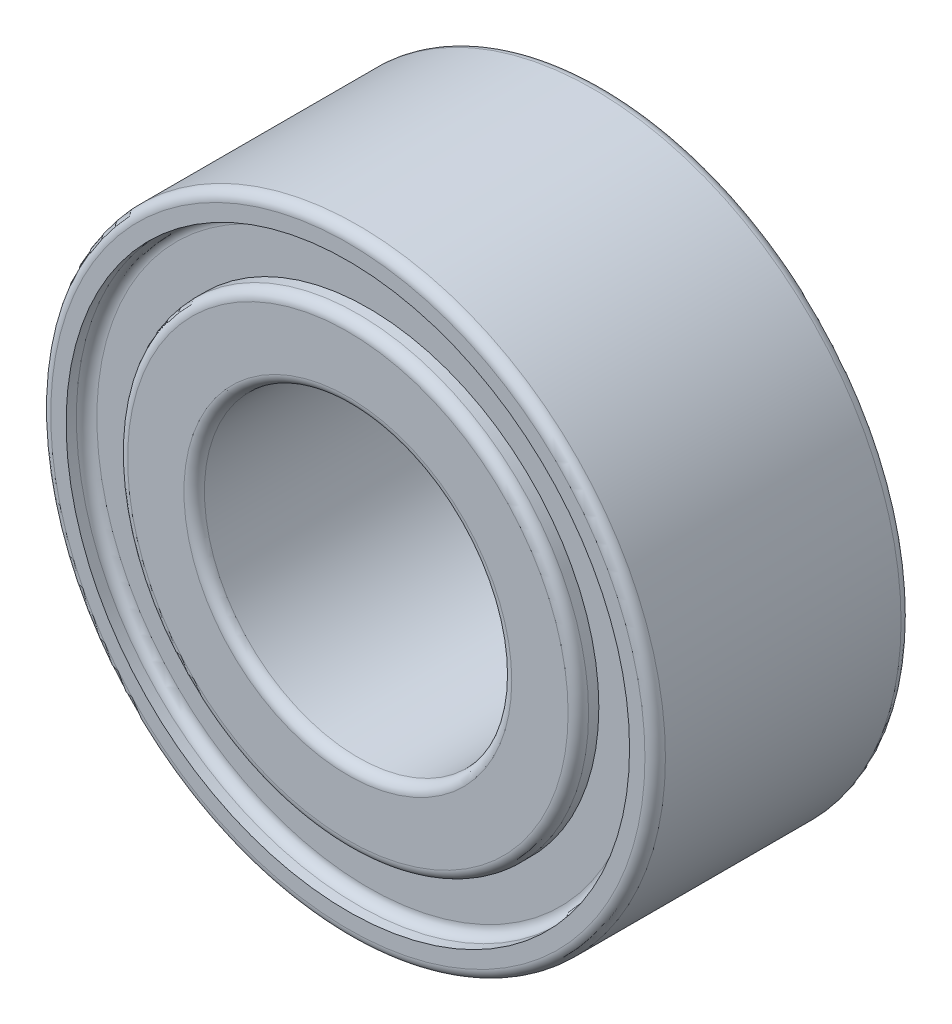
ISO-10303-21;
HEADER;
FILE_DESCRIPTION(('STEP AP214'),'2;1');
FILE_NAME('part.step','',(''),(''),'','','');
FILE_SCHEMA(('AUTOMOTIVE_DESIGN { 1 0 10303 214 1 1 1 1 }'));
ENDSEC;
DATA;
#1=APPLICATION_CONTEXT('core data for automotive mechanical design processes');
#2=APPLICATION_PROTOCOL_DEFINITION('international standard','automotive_design',2000,#1);
#3=PRODUCT_CONTEXT('',#1,'mechanical');
#4=PRODUCT('Part','Part','',(#3));
#5=PRODUCT_RELATED_PRODUCT_CATEGORY('part','',(#4));
#6=PRODUCT_DEFINITION_FORMATION('','',#4);
#7=PRODUCT_DEFINITION_CONTEXT('part definition',#1,'design');
#8=PRODUCT_DEFINITION('design','',#6,#7);
#9=PRODUCT_DEFINITION_SHAPE('','',#8);
#10=(LENGTH_UNIT() NAMED_UNIT(*) SI_UNIT(.MILLI.,.METRE.));
#11=(NAMED_UNIT(*) PLANE_ANGLE_UNIT() SI_UNIT($,.RADIAN.));
#12=(NAMED_UNIT(*) SI_UNIT($,.STERADIAN.) SOLID_ANGLE_UNIT());
#13=UNCERTAINTY_MEASURE_WITH_UNIT(LENGTH_MEASURE(1.E-05),#10,'distance_accuracy_value','');
#14=(GEOMETRIC_REPRESENTATION_CONTEXT(3) GLOBAL_UNCERTAINTY_ASSIGNED_CONTEXT((#13)) GLOBAL_UNIT_ASSIGNED_CONTEXT((#10,
#11,#12)) REPRESENTATION_CONTEXT('',''));
#15=CARTESIAN_POINT('',(0.,0.,0.));
#16=DIRECTION('',(0.,0.,1.));
#17=DIRECTION('',(1.,0.,0.));
#18=AXIS2_PLACEMENT_3D('',#15,#16,#17);
#19=CARTESIAN_POINT('',(0.,0.,0.));
#20=DIRECTION('',(0.,0.,1.));
#21=DIRECTION('',(1.,0.,0.));
#22=AXIS2_PLACEMENT_3D('',#19,#20,#21);
#23=PLANE('',#22);
#24=CARTESIAN_POINT('',(0.,0.,0.));
#25=DIRECTION('',(0.,0.,1.));
#26=DIRECTION('',(1.,0.,0.));
#27=AXIS2_PLACEMENT_3D('',#24,#25,#26);
#28=CIRCLE('',#27,1.6);
#29=CARTESIAN_POINT('',(1.6,0.,0.));
#30=VERTEX_POINT('',#29);
#31=EDGE_CURVE('E72',#30,#30,#28,.T.);
#32=ORIENTED_EDGE('',*,*,#31,.T.);
#33=EDGE_LOOP('',(#32));
#34=FACE_BOUND('',#33,.T.);
#35=CARTESIAN_POINT('',(0.,0.,0.));
#36=DIRECTION('',(0.,0.,1.));
#37=DIRECTION('',(1.,0.,0.));
#38=AXIS2_PLACEMENT_3D('',#35,#36,#37);
#39=CIRCLE('',#38,2.15);
#40=CARTESIAN_POINT('',(2.15,0.,0.));
#41=VERTEX_POINT('',#40);
#42=EDGE_CURVE('E75',#41,#41,#39,.F.);
#43=ORIENTED_EDGE('',*,*,#42,.T.);
#44=EDGE_LOOP('',(#43));
#45=FACE_BOUND('',#44,.T.);
#46=ADVANCED_FACE('F37',(#34,#45),#23,.F.);
#47=CARTESIAN_POINT('',(0.,0.,2.5));
#48=DIRECTION('',(0.,0.,1.));
#49=DIRECTION('',(1.,0.,0.));
#50=AXIS2_PLACEMENT_3D('',#47,#48,#49);
#51=PLANE('',#50);
#52=CARTESIAN_POINT('',(0.,0.,2.5));
#53=DIRECTION('',(0.,0.,1.));
#54=DIRECTION('',(1.,0.,0.));
#55=AXIS2_PLACEMENT_3D('',#52,#53,#54);
#56=CIRCLE('',#55,2.15);
#57=CARTESIAN_POINT('',(2.15,0.,2.5));
#58=VERTEX_POINT('',#57);
#59=EDGE_CURVE('E87',#58,#58,#56,.T.);
#60=ORIENTED_EDGE('',*,*,#59,.T.);
#61=EDGE_LOOP('',(#60));
#62=FACE_BOUND('',#61,.T.);
#63=CARTESIAN_POINT('',(0.,0.,2.5));
#64=DIRECTION('',(0.,0.,1.));
#65=DIRECTION('',(1.,0.,0.));
#66=AXIS2_PLACEMENT_3D('',#63,#64,#65);
#67=CIRCLE('',#66,1.6);
#68=CARTESIAN_POINT('',(1.6,0.,2.5));
#69=VERTEX_POINT('',#68);
#70=EDGE_CURVE('E90',#69,#69,#67,.F.);
#71=ORIENTED_EDGE('',*,*,#70,.T.);
#72=EDGE_LOOP('',(#71));
#73=FACE_BOUND('',#72,.T.);
#74=ADVANCED_FACE('F124',(#62,#73),#51,.T.);
#75=CARTESIAN_POINT('',(0.,0.,2.5));
#76=DIRECTION('',(0.,0.,1.));
#77=DIRECTION('',(1.,0.,0.));
#78=AXIS2_PLACEMENT_3D('',#75,#76,#77);
#79=CIRCLE('',#78,2.9);
#80=CARTESIAN_POINT('',(2.9,0.,2.5));
#81=VERTEX_POINT('',#80);
#82=EDGE_CURVE('E48',#81,#81,#79,.T.);
#83=ORIENTED_EDGE('',*,*,#82,.T.);
#84=EDGE_LOOP('',(#83));
#85=FACE_BOUND('',#84,.T.);
#86=CARTESIAN_POINT('',(0.,0.,2.5));
#87=DIRECTION('',(0.,0.,1.));
#88=DIRECTION('',(1.,0.,0.));
#89=AXIS2_PLACEMENT_3D('',#86,#87,#88);
#90=CIRCLE('',#89,2.75);
#91=CARTESIAN_POINT('',(2.75,0.,2.5));
#92=VERTEX_POINT('',#91);
#93=EDGE_CURVE('E93',#92,#92,#90,.T.);
#94=ORIENTED_EDGE('',*,*,#93,.F.);
#95=EDGE_LOOP('',(#94));
#96=FACE_BOUND('',#95,.T.);
#97=ADVANCED_FACE('F131',(#85,#96),#51,.T.);
#98=CARTESIAN_POINT('',(0.,0.,0.));
#99=DIRECTION('',(0.,0.,1.));
#100=DIRECTION('',(1.,0.,0.));
#101=AXIS2_PLACEMENT_3D('',#98,#99,#100);
#102=CIRCLE('',#101,2.85);
#103=CARTESIAN_POINT('',(2.85,0.,0.));
#104=VERTEX_POINT('',#103);
#105=EDGE_CURVE('E63',#104,#104,#102,.T.);
#106=ORIENTED_EDGE('',*,*,#105,.T.);
#107=EDGE_LOOP('',(#106));
#108=FACE_BOUND('',#107,.T.);
#109=CARTESIAN_POINT('',(0.,0.,0.));
#110=DIRECTION('',(0.,0.,1.));
#111=DIRECTION('',(1.,0.,0.));
#112=AXIS2_PLACEMENT_3D('',#109,#110,#111);
#113=CIRCLE('',#112,2.9);
#114=CARTESIAN_POINT('',(2.9,0.,0.));
#115=VERTEX_POINT('',#114);
#116=EDGE_CURVE('E66',#115,#115,#113,.F.);
#117=ORIENTED_EDGE('',*,*,#116,.T.);
#118=EDGE_LOOP('',(#117));
#119=FACE_BOUND('',#118,.T.);
#120=ADVANCED_FACE('F127',(#108,#119),#23,.F.);
#121=CARTESIAN_POINT('',(0.,0.,2.5));
#122=DIRECTION('',(0.,0.,-1.));
#123=DIRECTION('',(-1.,0.,0.));
#124=AXIS2_PLACEMENT_3D('',#121,#122,#123);
#125=CYLINDRICAL_SURFACE('',#124,3.);
#126=CARTESIAN_POINT('',(0.,0.,0.0999999999999998));
#127=DIRECTION('',(0.,0.,1.));
#128=DIRECTION('',(1.,0.,0.));
#129=AXIS2_PLACEMENT_3D('',#126,#127,#128);
#130=CIRCLE('',#129,3.);
#131=CARTESIAN_POINT('',(3.,0.,0.0999999999999998));
#132=VERTEX_POINT('',#131);
#133=EDGE_CURVE('E52',#132,#132,#130,.T.);
#134=ORIENTED_EDGE('',*,*,#133,.T.);
#135=EDGE_LOOP('',(#134));
#136=FACE_BOUND('',#135,.T.);
#137=CARTESIAN_POINT('',(0.,0.,2.4));
#138=DIRECTION('',(0.,0.,1.));
#139=DIRECTION('',(1.,0.,0.));
#140=AXIS2_PLACEMENT_3D('',#137,#138,#139);
#141=CIRCLE('',#140,3.);
#142=CARTESIAN_POINT('',(3.,0.,2.4));
#143=VERTEX_POINT('',#142);
#144=EDGE_CURVE('E57',#143,#143,#141,.F.);
#145=ORIENTED_EDGE('',*,*,#144,.T.);
#146=EDGE_LOOP('',(#145));
#147=FACE_BOUND('',#146,.T.);
#148=ADVANCED_FACE('F137',(#136,#147),#125,.T.);
#149=CARTESIAN_POINT('',(0.,0.,2.5));
#150=DIRECTION('',(0.,0.,-1.));
#151=DIRECTION('',(-1.,0.,0.));
#152=AXIS2_PLACEMENT_3D('',#149,#150,#151);
#153=CYLINDRICAL_SURFACE('',#152,1.5);
#154=CARTESIAN_POINT('',(0.,0.,2.4));
#155=DIRECTION('',(0.,0.,1.));
#156=DIRECTION('',(1.,0.,0.));
#157=AXIS2_PLACEMENT_3D('',#154,#155,#156);
#158=CIRCLE('',#157,1.5);
#159=CARTESIAN_POINT('',(1.5,0.,2.4));
#160=VERTEX_POINT('',#159);
#161=EDGE_CURVE('E78',#160,#160,#158,.T.);
#162=ORIENTED_EDGE('',*,*,#161,.T.);
#163=EDGE_LOOP('',(#162));
#164=FACE_BOUND('',#163,.T.);
#165=CARTESIAN_POINT('',(0.,0.,0.0999999999999998));
#166=DIRECTION('',(0.,0.,1.));
#167=DIRECTION('',(1.,0.,0.));
#168=AXIS2_PLACEMENT_3D('',#165,#166,#167);
#169=CIRCLE('',#168,1.5);
#170=CARTESIAN_POINT('',(1.5,0.,0.0999999999999998));
#171=VERTEX_POINT('',#170);
#172=EDGE_CURVE('E81',#171,#171,#169,.F.);
#173=ORIENTED_EDGE('',*,*,#172,.T.);
#174=EDGE_LOOP('',(#173));
#175=FACE_BOUND('',#174,.T.);
#176=ADVANCED_FACE('F143',(#164,#175),#153,.F.);
#177=CARTESIAN_POINT('',(0.,0.,2.3));
#178=DIRECTION('',(0.,0.,1.));
#179=DIRECTION('',(1.,0.,0.));
#180=AXIS2_PLACEMENT_3D('',#177,#178,#179);
#181=CYLINDRICAL_SURFACE('',#180,2.75);
#182=CARTESIAN_POINT('',(0.,0.,2.4));
#183=DIRECTION('',(0.,0.,1.));
#184=DIRECTION('',(1.,0.,0.));
#185=AXIS2_PLACEMENT_3D('',#182,#183,#184);
#186=CIRCLE('',#185,2.75);
#187=CARTESIAN_POINT('',(2.75,0.,2.4));
#188=VERTEX_POINT('',#187);
#189=EDGE_CURVE('E10',#188,#188,#186,.F.);
#190=ORIENTED_EDGE('',*,*,#189,.T.);
#191=EDGE_LOOP('',(#190));
#192=FACE_BOUND('',#191,.T.);
#193=ORIENTED_EDGE('',*,*,#93,.T.);
#194=EDGE_LOOP('',(#193));
#195=FACE_BOUND('',#194,.T.);
#196=ADVANCED_FACE('F166',(#192,#195),#181,.F.);
#197=CARTESIAN_POINT('',(0.,0.,2.3));
#198=DIRECTION('',(0.,0.,1.));
#199=DIRECTION('',(1.,0.,0.));
#200=AXIS2_PLACEMENT_3D('',#197,#198,#199);
#201=PLANE('',#200);
#202=CARTESIAN_POINT('',(0.,0.,2.3));
#203=DIRECTION('',(0.,0.,1.));
#204=DIRECTION('',(1.,0.,0.));
#205=AXIS2_PLACEMENT_3D('',#202,#203,#204);
#206=CIRCLE('',#205,2.65);
#207=CARTESIAN_POINT('',(2.65,0.,2.3));
#208=VERTEX_POINT('',#207);
#209=EDGE_CURVE('E44',#208,#208,#206,.T.);
#210=ORIENTED_EDGE('',*,*,#209,.T.);
#211=EDGE_LOOP('',(#210));
#212=FACE_BOUND('',#211,.T.);
#213=CARTESIAN_POINT('',(0.,0.,2.3));
#214=DIRECTION('',(0.,0.,1.));
#215=DIRECTION('',(1.,0.,0.));
#216=AXIS2_PLACEMENT_3D('',#213,#214,#215);
#217=CIRCLE('',#216,2.25);
#218=CARTESIAN_POINT('',(2.25,0.,2.3));
#219=VERTEX_POINT('',#218);
#220=EDGE_CURVE('E96',#219,#219,#217,.T.);
#221=ORIENTED_EDGE('',*,*,#220,.F.);
#222=EDGE_LOOP('',(#221));
#223=FACE_BOUND('',#222,.T.);
#224=ADVANCED_FACE('F168',(#212,#223),#201,.T.);
#225=CARTESIAN_POINT('',(0.,0.,2.3));
#226=DIRECTION('',(0.,0.,1.));
#227=DIRECTION('',(1.,0.,0.));
#228=AXIS2_PLACEMENT_3D('',#225,#226,#227);
#229=CYLINDRICAL_SURFACE('',#228,2.25);
#230=CARTESIAN_POINT('',(0.,0.,2.4));
#231=DIRECTION('',(0.,0.,1.));
#232=DIRECTION('',(1.,0.,0.));
#233=AXIS2_PLACEMENT_3D('',#230,#231,#232);
#234=CIRCLE('',#233,2.25);
#235=CARTESIAN_POINT('',(2.25,0.,2.4));
#236=VERTEX_POINT('',#235);
#237=EDGE_CURVE('E84',#236,#236,#234,.F.);
#238=ORIENTED_EDGE('',*,*,#237,.T.);
#239=EDGE_LOOP('',(#238));
#240=FACE_BOUND('',#239,.T.);
#241=ORIENTED_EDGE('',*,*,#220,.T.);
#242=EDGE_LOOP('',(#241));
#243=FACE_BOUND('',#242,.T.);
#244=ADVANCED_FACE('F174',(#240,#243),#229,.T.);
#245=CARTESIAN_POINT('',(0.,0.,0.));
#246=DIRECTION('',(0.,0.,1.));
#247=DIRECTION('',(1.,0.,0.));
#248=AXIS2_PLACEMENT_3D('',#245,#246,#247);
#249=CYLINDRICAL_SURFACE('',#248,2.75);
#250=CARTESIAN_POINT('',(0.,0.,0.1));
#251=DIRECTION('',(0.,0.,1.));
#252=DIRECTION('',(1.,0.,0.));
#253=AXIS2_PLACEMENT_3D('',#250,#251,#252);
#254=CIRCLE('',#253,2.75);
#255=CARTESIAN_POINT('',(2.75,0.,0.1));
#256=VERTEX_POINT('',#255);
#257=EDGE_CURVE('E60',#256,#256,#254,.F.);
#258=ORIENTED_EDGE('',*,*,#257,.T.);
#259=EDGE_LOOP('',(#258));
#260=FACE_BOUND('',#259,.T.);
#261=CARTESIAN_POINT('',(0.,0.,0.2));
#262=DIRECTION('',(0.,0.,1.));
#263=DIRECTION('',(1.,0.,0.));
#264=AXIS2_PLACEMENT_3D('',#261,#262,#263);
#265=CIRCLE('',#264,2.75);
#266=CARTESIAN_POINT('',(2.75,0.,0.2));
#267=VERTEX_POINT('',#266);
#268=EDGE_CURVE('E99',#267,#267,#265,.T.);
#269=ORIENTED_EDGE('',*,*,#268,.T.);
#270=EDGE_LOOP('',(#269));
#271=FACE_BOUND('',#270,.T.);
#272=ADVANCED_FACE('F121',(#260,#271),#249,.F.);
#273=CARTESIAN_POINT('',(0.,0.,0.2));
#274=DIRECTION('',(0.,0.,1.));
#275=DIRECTION('',(1.,0.,0.));
#276=AXIS2_PLACEMENT_3D('',#273,#274,#275);
#277=PLANE('',#276);
#278=CARTESIAN_POINT('',(0.,0.,0.2));
#279=DIRECTION('',(0.,0.,1.));
#280=DIRECTION('',(1.,0.,0.));
#281=AXIS2_PLACEMENT_3D('',#278,#279,#280);
#282=CIRCLE('',#281,2.25);
#283=CARTESIAN_POINT('',(2.25,0.,0.2));
#284=VERTEX_POINT('',#283);
#285=EDGE_CURVE('E102',#284,#284,#282,.T.);
#286=ORIENTED_EDGE('',*,*,#285,.T.);
#287=EDGE_LOOP('',(#286));
#288=FACE_BOUND('',#287,.T.);
#289=ORIENTED_EDGE('',*,*,#268,.F.);
#290=EDGE_LOOP('',(#289));
#291=FACE_BOUND('',#290,.T.);
#292=ADVANCED_FACE('F106',(#288,#291),#277,.F.);
#293=CARTESIAN_POINT('',(0.,0.,0.));
#294=DIRECTION('',(0.,0.,1.));
#295=DIRECTION('',(1.,0.,0.));
#296=AXIS2_PLACEMENT_3D('',#293,#294,#295);
#297=CYLINDRICAL_SURFACE('',#296,2.25);
#298=CARTESIAN_POINT('',(0.,0.,0.1));
#299=DIRECTION('',(0.,0.,1.));
#300=DIRECTION('',(1.,0.,0.));
#301=AXIS2_PLACEMENT_3D('',#298,#299,#300);
#302=CIRCLE('',#301,2.25);
#303=CARTESIAN_POINT('',(2.25,0.,0.1));
#304=VERTEX_POINT('',#303);
#305=EDGE_CURVE('E69',#304,#304,#302,.T.);
#306=ORIENTED_EDGE('',*,*,#305,.T.);
#307=EDGE_LOOP('',(#306));
#308=FACE_BOUND('',#307,.T.);
#309=ORIENTED_EDGE('',*,*,#285,.F.);
#310=EDGE_LOOP('',(#309));
#311=FACE_BOUND('',#310,.T.);
#312=ADVANCED_FACE('F109',(#308,#311),#297,.T.);
#313=CARTESIAN_POINT('',(0.,0.,2.4));
#314=DIRECTION('',(0.,0.,1.));
#315=DIRECTION('',(1.,0.,0.));
#316=AXIS2_PLACEMENT_3D('',#313,#314,#315);
#317=TOROIDAL_SURFACE('',#316,2.15,0.1);
#318=ORIENTED_EDGE('',*,*,#237,.F.);
#319=EDGE_LOOP('',(#318));
#320=FACE_BOUND('',#319,.T.);
#321=ORIENTED_EDGE('',*,*,#59,.F.);
#322=EDGE_LOOP('',(#321));
#323=FACE_BOUND('',#322,.T.);
#324=ADVANCED_FACE('F111',(#320,#323),#317,.T.);
#325=CARTESIAN_POINT('',(0.,0.,2.4));
#326=DIRECTION('',(0.,0.,1.));
#327=DIRECTION('',(1.,0.,0.));
#328=AXIS2_PLACEMENT_3D('',#325,#326,#327);
#329=TOROIDAL_SURFACE('',#328,1.6,0.1);
#330=ORIENTED_EDGE('',*,*,#70,.F.);
#331=EDGE_LOOP('',(#330));
#332=FACE_BOUND('',#331,.T.);
#333=ORIENTED_EDGE('',*,*,#161,.F.);
#334=EDGE_LOOP('',(#333));
#335=FACE_BOUND('',#334,.T.);
#336=ADVANCED_FACE('F118',(#332,#335),#329,.T.);
#337=CARTESIAN_POINT('',(0.,0.,0.0999999999999998));
#338=DIRECTION('',(0.,0.,1.));
#339=DIRECTION('',(1.,0.,0.));
#340=AXIS2_PLACEMENT_3D('',#337,#338,#339);
#341=TOROIDAL_SURFACE('',#340,1.6,0.1);
#342=ORIENTED_EDGE('',*,*,#172,.F.);
#343=EDGE_LOOP('',(#342));
#344=FACE_BOUND('',#343,.T.);
#345=ORIENTED_EDGE('',*,*,#31,.F.);
#346=EDGE_LOOP('',(#345));
#347=FACE_BOUND('',#346,.T.);
#348=ADVANCED_FACE('F197',(#344,#347),#341,.T.);
#349=CARTESIAN_POINT('',(0.,0.,0.1));
#350=DIRECTION('',(0.,0.,1.));
#351=DIRECTION('',(1.,0.,0.));
#352=AXIS2_PLACEMENT_3D('',#349,#350,#351);
#353=TOROIDAL_SURFACE('',#352,2.15,0.1);
#354=ORIENTED_EDGE('',*,*,#42,.F.);
#355=EDGE_LOOP('',(#354));
#356=FACE_BOUND('',#355,.T.);
#357=ORIENTED_EDGE('',*,*,#305,.F.);
#358=EDGE_LOOP('',(#357));
#359=FACE_BOUND('',#358,.T.);
#360=ADVANCED_FACE('F192',(#356,#359),#353,.T.);
#361=CARTESIAN_POINT('',(0.,0.,0.1));
#362=DIRECTION('',(0.,0.,1.));
#363=DIRECTION('',(1.,0.,0.));
#364=AXIS2_PLACEMENT_3D('',#361,#362,#363);
#365=TOROIDAL_SURFACE('',#364,2.85,0.1);
#366=ORIENTED_EDGE('',*,*,#257,.F.);
#367=EDGE_LOOP('',(#366));
#368=FACE_BOUND('',#367,.T.);
#369=ORIENTED_EDGE('',*,*,#105,.F.);
#370=EDGE_LOOP('',(#369));
#371=FACE_BOUND('',#370,.T.);
#372=ADVANCED_FACE('F154',(#368,#371),#365,.T.);
#373=CARTESIAN_POINT('',(0.,0.,0.0999999999999998));
#374=DIRECTION('',(0.,0.,1.));
#375=DIRECTION('',(1.,0.,0.));
#376=AXIS2_PLACEMENT_3D('',#373,#374,#375);
#377=TOROIDAL_SURFACE('',#376,2.9,0.1);
#378=ORIENTED_EDGE('',*,*,#116,.F.);
#379=EDGE_LOOP('',(#378));
#380=FACE_BOUND('',#379,.T.);
#381=ORIENTED_EDGE('',*,*,#133,.F.);
#382=EDGE_LOOP('',(#381));
#383=FACE_BOUND('',#382,.T.);
#384=ADVANCED_FACE('F150',(#380,#383),#377,.T.);
#385=CARTESIAN_POINT('',(0.,0.,2.4));
#386=DIRECTION('',(0.,0.,1.));
#387=DIRECTION('',(1.,0.,0.));
#388=AXIS2_PLACEMENT_3D('',#385,#386,#387);
#389=TOROIDAL_SURFACE('',#388,2.9,0.1);
#390=ORIENTED_EDGE('',*,*,#144,.F.);
#391=EDGE_LOOP('',(#390));
#392=FACE_BOUND('',#391,.T.);
#393=ORIENTED_EDGE('',*,*,#82,.F.);
#394=EDGE_LOOP('',(#393));
#395=FACE_BOUND('',#394,.T.);
#396=ADVANCED_FACE('F153',(#392,#395),#389,.T.);
#397=CARTESIAN_POINT('',(0.,0.,2.4));
#398=DIRECTION('',(0.,0.,1.));
#399=DIRECTION('',(1.,0.,0.));
#400=AXIS2_PLACEMENT_3D('',#397,#398,#399);
#401=TOROIDAL_SURFACE('',#400,2.65,0.1);
#402=ORIENTED_EDGE('',*,*,#189,.F.);
#403=EDGE_LOOP('',(#402));
#404=FACE_BOUND('',#403,.T.);
#405=ORIENTED_EDGE('',*,*,#209,.F.);
#406=EDGE_LOOP('',(#405));
#407=FACE_BOUND('',#406,.T.);
#408=ADVANCED_FACE('F39',(#404,#407),#401,.F.);
#409=CLOSED_SHELL('',(#46,#74,#97,#120,#148,#176,#196,#224,#244,#272,#292,#312,#324,#336,#348,
#360,#372,#384,#396,#408));
#410=MANIFOLD_SOLID_BREP('B2',#409);
#411=ADVANCED_BREP_SHAPE_REPRESENTATION('',(#18,#410),#14);
#412=SHAPE_DEFINITION_REPRESENTATION(#9,#411);
ENDSEC;
END-ISO-10303-21;
